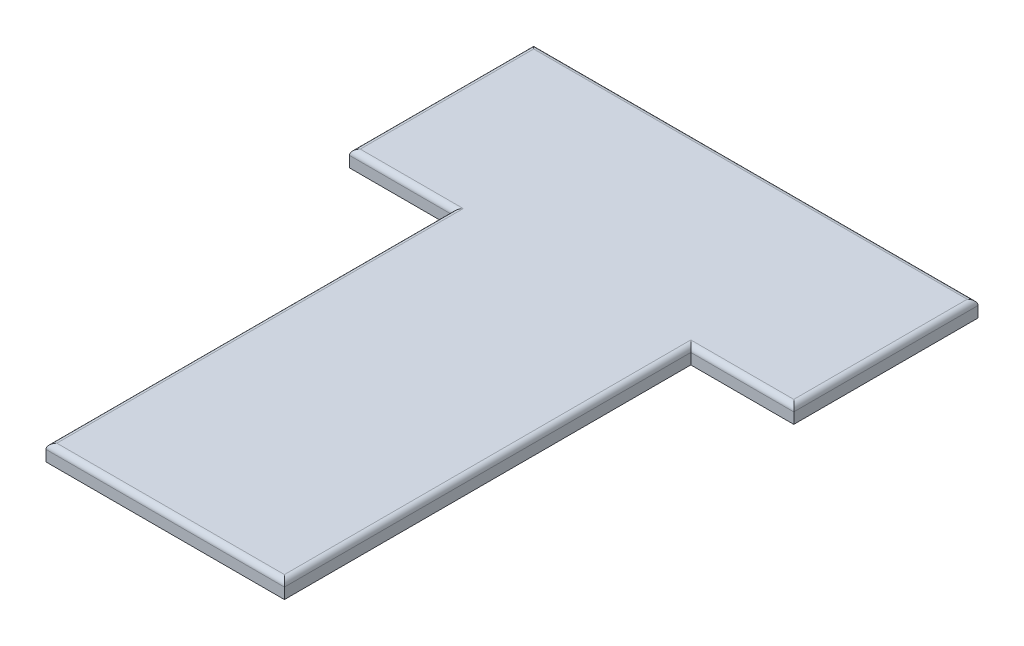
ISO-10303-21;
HEADER;
FILE_DESCRIPTION(('STEP AP214'),'2;1');
FILE_NAME('part.step','',(''),(''),'','','');
FILE_SCHEMA(('AUTOMOTIVE_DESIGN { 1 0 10303 214 1 1 1 1 }'));
ENDSEC;
DATA;
#1=APPLICATION_CONTEXT('core data for automotive mechanical design processes');
#2=APPLICATION_PROTOCOL_DEFINITION('international standard','automotive_design',2000,#1);
#3=PRODUCT_CONTEXT('',#1,'mechanical');
#4=PRODUCT('Part','Part','',(#3));
#5=PRODUCT_RELATED_PRODUCT_CATEGORY('part','',(#4));
#6=PRODUCT_DEFINITION_FORMATION('','',#4);
#7=PRODUCT_DEFINITION_CONTEXT('part definition',#1,'design');
#8=PRODUCT_DEFINITION('design','',#6,#7);
#9=PRODUCT_DEFINITION_SHAPE('','',#8);
#10=(LENGTH_UNIT() NAMED_UNIT(*) SI_UNIT(.MILLI.,.METRE.));
#11=(NAMED_UNIT(*) PLANE_ANGLE_UNIT() SI_UNIT($,.RADIAN.));
#12=(NAMED_UNIT(*) SI_UNIT($,.STERADIAN.) SOLID_ANGLE_UNIT());
#13=UNCERTAINTY_MEASURE_WITH_UNIT(LENGTH_MEASURE(1.E-05),#10,'distance_accuracy_value','');
#14=(GEOMETRIC_REPRESENTATION_CONTEXT(3) GLOBAL_UNCERTAINTY_ASSIGNED_CONTEXT((#13)) GLOBAL_UNIT_ASSIGNED_CONTEXT((#10,
#11,#12)) REPRESENTATION_CONTEXT('',''));
#15=CARTESIAN_POINT('',(0.,0.,0.));
#16=DIRECTION('',(0.,0.,1.));
#17=DIRECTION('',(1.,0.,0.));
#18=AXIS2_PLACEMENT_3D('',#15,#16,#17);
#19=CARTESIAN_POINT('',(63.,3.,0.));
#20=DIRECTION('',(0.,0.,-1.));
#21=DIRECTION('',(-1.,0.,0.));
#22=AXIS2_PLACEMENT_3D('',#19,#20,#21);
#23=PLANE('',#22);
#24=DIRECTION('',(0.,-1.,0.));
#25=VECTOR('',#24,1.);
#26=CARTESIAN_POINT('',(63.,3.,0.));
#27=LINE('',#26,#25);
#28=CARTESIAN_POINT('',(63.,2.,0.));
#29=VERTEX_POINT('',#28);
#30=CARTESIAN_POINT('',(63.,0.,0.));
#31=VERTEX_POINT('',#30);
#32=EDGE_CURVE('E126',#29,#31,#27,.T.);
#33=ORIENTED_EDGE('',*,*,#32,.F.);
#34=DIRECTION('',(1.,0.,0.));
#35=VECTOR('',#34,1.);
#36=CARTESIAN_POINT('',(63.,2.,0.));
#37=LINE('',#36,#35);
#38=CARTESIAN_POINT('',(19.,2.,0.));
#39=VERTEX_POINT('',#38);
#40=EDGE_CURVE('E206',#29,#39,#37,.F.);
#41=ORIENTED_EDGE('',*,*,#40,.T.);
#42=DIRECTION('',(0.,-1.,0.));
#43=VECTOR('',#42,1.);
#44=CARTESIAN_POINT('',(19.,3.,0.));
#45=LINE('',#44,#43);
#46=CARTESIAN_POINT('',(19.,0.,0.));
#47=VERTEX_POINT('',#46);
#48=EDGE_CURVE('E149',#39,#47,#45,.T.);
#49=ORIENTED_EDGE('',*,*,#48,.T.);
#50=DIRECTION('',(1.,0.,0.));
#51=VECTOR('',#50,1.);
#52=CARTESIAN_POINT('',(63.,0.,0.));
#53=LINE('',#52,#51);
#54=EDGE_CURVE('E144',#47,#31,#53,.T.);
#55=ORIENTED_EDGE('',*,*,#54,.T.);
#56=EDGE_LOOP('',(#33,#41,#49,#55));
#57=FACE_BOUND('',#56,.T.);
#58=ADVANCED_FACE('F36',(#57),#23,.F.);
#59=CARTESIAN_POINT('',(63.,3.,-75.));
#60=DIRECTION('',(-1.,0.,0.));
#61=DIRECTION('',(0.,0.,1.));
#62=AXIS2_PLACEMENT_3D('',#59,#60,#61);
#63=PLANE('',#62);
#64=DIRECTION('',(0.,-1.,0.));
#65=VECTOR('',#64,1.);
#66=CARTESIAN_POINT('',(63.,3.,-75.));
#67=LINE('',#66,#65);
#68=CARTESIAN_POINT('',(63.,2.,-75.));
#69=VERTEX_POINT('',#68);
#70=CARTESIAN_POINT('',(63.,0.,-75.));
#71=VERTEX_POINT('',#70);
#72=EDGE_CURVE('E138',#69,#71,#67,.T.);
#73=ORIENTED_EDGE('',*,*,#72,.F.);
#74=DIRECTION('',(0.,0.,-1.));
#75=VECTOR('',#74,1.);
#76=CARTESIAN_POINT('',(63.,2.,-75.));
#77=LINE('',#76,#75);
#78=EDGE_CURVE('E133',#69,#29,#77,.F.);
#79=ORIENTED_EDGE('',*,*,#78,.T.);
#80=ORIENTED_EDGE('',*,*,#32,.T.);
#81=DIRECTION('',(0.,0.,-1.));
#82=VECTOR('',#81,1.);
#83=CARTESIAN_POINT('',(63.,0.,-75.));
#84=LINE('',#83,#82);
#85=EDGE_CURVE('E130',#31,#71,#84,.T.);
#86=ORIENTED_EDGE('',*,*,#85,.T.);
#87=EDGE_LOOP('',(#73,#79,#80,#86));
#88=FACE_BOUND('',#87,.T.);
#89=ADVANCED_FACE('F129',(#88),#63,.F.);
#90=CARTESIAN_POINT('',(82.,3.,-75.));
#91=DIRECTION('',(0.,0.,-1.));
#92=DIRECTION('',(-1.,0.,0.));
#93=AXIS2_PLACEMENT_3D('',#90,#91,#92);
#94=PLANE('',#93);
#95=DIRECTION('',(0.,-1.,0.));
#96=VECTOR('',#95,1.);
#97=CARTESIAN_POINT('',(82.,3.,-75.));
#98=LINE('',#97,#96);
#99=CARTESIAN_POINT('',(82.,2.,-75.));
#100=VERTEX_POINT('',#99);
#101=CARTESIAN_POINT('',(82.,0.,-75.));
#102=VERTEX_POINT('',#101);
#103=EDGE_CURVE('E179',#100,#102,#98,.T.);
#104=ORIENTED_EDGE('',*,*,#103,.F.);
#105=DIRECTION('',(1.,0.,0.));
#106=VECTOR('',#105,1.);
#107=CARTESIAN_POINT('',(82.,2.,-75.));
#108=LINE('',#107,#106);
#109=EDGE_CURVE('E203',#100,#69,#108,.F.);
#110=ORIENTED_EDGE('',*,*,#109,.T.);
#111=ORIENTED_EDGE('',*,*,#72,.T.);
#112=DIRECTION('',(1.,0.,0.));
#113=VECTOR('',#112,1.);
#114=CARTESIAN_POINT('',(82.,0.,-75.));
#115=LINE('',#114,#113);
#116=EDGE_CURVE('E147',#71,#102,#115,.T.);
#117=ORIENTED_EDGE('',*,*,#116,.T.);
#118=EDGE_LOOP('',(#104,#110,#111,#117));
#119=FACE_BOUND('',#118,.T.);
#120=ADVANCED_FACE('F270',(#119),#94,.F.);
#121=CARTESIAN_POINT('',(82.,3.,-109.));
#122=DIRECTION('',(-1.,0.,0.));
#123=DIRECTION('',(0.,0.,1.));
#124=AXIS2_PLACEMENT_3D('',#121,#122,#123);
#125=PLANE('',#124);
#126=DIRECTION('',(0.,-1.,0.));
#127=VECTOR('',#126,1.);
#128=CARTESIAN_POINT('',(82.,3.,-109.));
#129=LINE('',#128,#127);
#130=CARTESIAN_POINT('',(82.,2.,-109.));
#131=VERTEX_POINT('',#130);
#132=CARTESIAN_POINT('',(82.,0.,-109.));
#133=VERTEX_POINT('',#132);
#134=EDGE_CURVE('E177',#131,#133,#129,.T.);
#135=ORIENTED_EDGE('',*,*,#134,.F.);
#136=DIRECTION('',(0.,0.,-1.));
#137=VECTOR('',#136,1.);
#138=CARTESIAN_POINT('',(82.,2.,-109.));
#139=LINE('',#138,#137);
#140=EDGE_CURVE('E201',#131,#100,#139,.F.);
#141=ORIENTED_EDGE('',*,*,#140,.T.);
#142=ORIENTED_EDGE('',*,*,#103,.T.);
#143=DIRECTION('',(0.,0.,-1.));
#144=VECTOR('',#143,1.);
#145=CARTESIAN_POINT('',(82.,0.,-109.));
#146=LINE('',#145,#144);
#147=EDGE_CURVE('E156',#102,#133,#146,.T.);
#148=ORIENTED_EDGE('',*,*,#147,.T.);
#149=EDGE_LOOP('',(#135,#141,#142,#148));
#150=FACE_BOUND('',#149,.T.);
#151=ADVANCED_FACE('F267',(#150),#125,.F.);
#152=CARTESIAN_POINT('',(0.,3.,-109.));
#153=DIRECTION('',(0.,0.,1.));
#154=DIRECTION('',(1.,0.,0.));
#155=AXIS2_PLACEMENT_3D('',#152,#153,#154);
#156=PLANE('',#155);
#157=DIRECTION('',(0.,-1.,0.));
#158=VECTOR('',#157,1.);
#159=CARTESIAN_POINT('',(0.,3.,-109.));
#160=LINE('',#159,#158);
#161=CARTESIAN_POINT('',(0.,2.,-109.));
#162=VERTEX_POINT('',#161);
#163=CARTESIAN_POINT('',(0.,0.,-109.));
#164=VERTEX_POINT('',#163);
#165=EDGE_CURVE('E175',#162,#164,#160,.T.);
#166=ORIENTED_EDGE('',*,*,#165,.F.);
#167=DIRECTION('',(-1.,0.,0.));
#168=VECTOR('',#167,1.);
#169=CARTESIAN_POINT('',(0.,2.,-109.));
#170=LINE('',#169,#168);
#171=EDGE_CURVE('E198',#162,#131,#170,.F.);
#172=ORIENTED_EDGE('',*,*,#171,.T.);
#173=ORIENTED_EDGE('',*,*,#134,.T.);
#174=DIRECTION('',(-1.,0.,0.));
#175=VECTOR('',#174,1.);
#176=CARTESIAN_POINT('',(0.,0.,-109.));
#177=LINE('',#176,#175);
#178=EDGE_CURVE('E159',#133,#164,#177,.T.);
#179=ORIENTED_EDGE('',*,*,#178,.T.);
#180=EDGE_LOOP('',(#166,#172,#173,#179));
#181=FACE_BOUND('',#180,.T.);
#182=ADVANCED_FACE('F252',(#181),#156,.F.);
#183=CARTESIAN_POINT('',(0.,3.,-75.));
#184=DIRECTION('',(1.,0.,0.));
#185=DIRECTION('',(0.,0.,-1.));
#186=AXIS2_PLACEMENT_3D('',#183,#184,#185);
#187=PLANE('',#186);
#188=DIRECTION('',(0.,-1.,0.));
#189=VECTOR('',#188,1.);
#190=CARTESIAN_POINT('',(0.,3.,-75.));
#191=LINE('',#190,#189);
#192=CARTESIAN_POINT('',(0.,2.,-75.));
#193=VERTEX_POINT('',#192);
#194=CARTESIAN_POINT('',(0.,0.,-75.));
#195=VERTEX_POINT('',#194);
#196=EDGE_CURVE('E173',#193,#195,#191,.T.);
#197=ORIENTED_EDGE('',*,*,#196,.F.);
#198=DIRECTION('',(0.,0.,1.));
#199=VECTOR('',#198,1.);
#200=CARTESIAN_POINT('',(0.,2.,-75.));
#201=LINE('',#200,#199);
#202=EDGE_CURVE('E11',#193,#162,#201,.F.);
#203=ORIENTED_EDGE('',*,*,#202,.T.);
#204=ORIENTED_EDGE('',*,*,#165,.T.);
#205=DIRECTION('',(0.,0.,1.));
#206=VECTOR('',#205,1.);
#207=CARTESIAN_POINT('',(0.,0.,-75.));
#208=LINE('',#207,#206);
#209=EDGE_CURVE('E162',#164,#195,#208,.T.);
#210=ORIENTED_EDGE('',*,*,#209,.T.);
#211=EDGE_LOOP('',(#197,#203,#204,#210));
#212=FACE_BOUND('',#211,.T.);
#213=ADVANCED_FACE('F249',(#212),#187,.F.);
#214=CARTESIAN_POINT('',(19.,3.,-75.));
#215=DIRECTION('',(0.,0.,-1.));
#216=DIRECTION('',(-1.,0.,0.));
#217=AXIS2_PLACEMENT_3D('',#214,#215,#216);
#218=PLANE('',#217);
#219=DIRECTION('',(0.,-1.,0.));
#220=VECTOR('',#219,1.);
#221=CARTESIAN_POINT('',(19.,3.,-75.));
#222=LINE('',#221,#220);
#223=CARTESIAN_POINT('',(19.,2.,-75.));
#224=VERTEX_POINT('',#223);
#225=CARTESIAN_POINT('',(19.,0.,-75.));
#226=VERTEX_POINT('',#225);
#227=EDGE_CURVE('E171',#224,#226,#222,.T.);
#228=ORIENTED_EDGE('',*,*,#227,.F.);
#229=DIRECTION('',(1.,0.,0.));
#230=VECTOR('',#229,1.);
#231=CARTESIAN_POINT('',(19.,2.,-75.));
#232=LINE('',#231,#230);
#233=EDGE_CURVE('E45',#224,#193,#232,.F.);
#234=ORIENTED_EDGE('',*,*,#233,.T.);
#235=ORIENTED_EDGE('',*,*,#196,.T.);
#236=DIRECTION('',(1.,0.,0.));
#237=VECTOR('',#236,1.);
#238=CARTESIAN_POINT('',(19.,0.,-75.));
#239=LINE('',#238,#237);
#240=EDGE_CURVE('E165',#195,#226,#239,.T.);
#241=ORIENTED_EDGE('',*,*,#240,.T.);
#242=EDGE_LOOP('',(#228,#234,#235,#241));
#243=FACE_BOUND('',#242,.T.);
#244=ADVANCED_FACE('F365',(#243),#218,.F.);
#245=CARTESIAN_POINT('',(19.,3.,0.));
#246=DIRECTION('',(1.,0.,0.));
#247=DIRECTION('',(0.,0.,-1.));
#248=AXIS2_PLACEMENT_3D('',#245,#246,#247);
#249=PLANE('',#248);
#250=ORIENTED_EDGE('',*,*,#48,.F.);
#251=DIRECTION('',(0.,0.,1.));
#252=VECTOR('',#251,1.);
#253=CARTESIAN_POINT('',(19.,2.,0.));
#254=LINE('',#253,#252);
#255=EDGE_CURVE('E60',#39,#224,#254,.F.);
#256=ORIENTED_EDGE('',*,*,#255,.T.);
#257=ORIENTED_EDGE('',*,*,#227,.T.);
#258=DIRECTION('',(0.,0.,1.));
#259=VECTOR('',#258,1.);
#260=CARTESIAN_POINT('',(19.,0.,0.));
#261=LINE('',#260,#259);
#262=EDGE_CURVE('E168',#226,#47,#261,.T.);
#263=ORIENTED_EDGE('',*,*,#262,.T.);
#264=EDGE_LOOP('',(#250,#256,#257,#263));
#265=FACE_BOUND('',#264,.T.);
#266=ADVANCED_FACE('F357',(#265),#249,.F.);
#267=CARTESIAN_POINT('',(0.,3.,0.));
#268=DIRECTION('',(0.,-1.,0.));
#269=DIRECTION('',(0.,0.,-1.));
#270=AXIS2_PLACEMENT_3D('',#267,#268,#269);
#271=PLANE('',#270);
#272=DIRECTION('',(0.,0.,-1.));
#273=VECTOR('',#272,1.);
#274=CARTESIAN_POINT('',(81.,3.,0.));
#275=LINE('',#274,#273);
#276=CARTESIAN_POINT('',(81.,3.,-76.));
#277=VERTEX_POINT('',#276);
#278=CARTESIAN_POINT('',(81.,3.,-108.));
#279=VERTEX_POINT('',#278);
#280=EDGE_CURVE('E193',#277,#279,#275,.T.);
#281=ORIENTED_EDGE('',*,*,#280,.T.);
#282=DIRECTION('',(-1.,0.,0.));
#283=VECTOR('',#282,1.);
#284=CARTESIAN_POINT('',(0.,3.,-108.));
#285=LINE('',#284,#283);
#286=CARTESIAN_POINT('',(1.,3.,-108.));
#287=VERTEX_POINT('',#286);
#288=EDGE_CURVE('E195',#279,#287,#285,.T.);
#289=ORIENTED_EDGE('',*,*,#288,.T.);
#290=DIRECTION('',(0.,0.,1.));
#291=VECTOR('',#290,1.);
#292=CARTESIAN_POINT('',(1.,3.,0.));
#293=LINE('',#292,#291);
#294=CARTESIAN_POINT('',(1.,3.,-76.));
#295=VERTEX_POINT('',#294);
#296=EDGE_CURVE('E137',#287,#295,#293,.T.);
#297=ORIENTED_EDGE('',*,*,#296,.T.);
#298=DIRECTION('',(1.,0.,0.));
#299=VECTOR('',#298,1.);
#300=CARTESIAN_POINT('',(0.,3.,-76.));
#301=LINE('',#300,#299);
#302=CARTESIAN_POINT('',(20.,3.,-76.));
#303=VERTEX_POINT('',#302);
#304=EDGE_CURVE('E183',#295,#303,#301,.T.);
#305=ORIENTED_EDGE('',*,*,#304,.T.);
#306=DIRECTION('',(0.,0.,1.));
#307=VECTOR('',#306,1.);
#308=CARTESIAN_POINT('',(20.,3.,0.));
#309=LINE('',#308,#307);
#310=CARTESIAN_POINT('',(20.,3.,-0.999999999999995));
#311=VERTEX_POINT('',#310);
#312=EDGE_CURVE('E185',#303,#311,#309,.T.);
#313=ORIENTED_EDGE('',*,*,#312,.T.);
#314=DIRECTION('',(1.,0.,0.));
#315=VECTOR('',#314,1.);
#316=CARTESIAN_POINT('',(0.,3.,-0.999999999999992));
#317=LINE('',#316,#315);
#318=CARTESIAN_POINT('',(62.,3.,-1.));
#319=VERTEX_POINT('',#318);
#320=EDGE_CURVE('E187',#311,#319,#317,.T.);
#321=ORIENTED_EDGE('',*,*,#320,.T.);
#322=DIRECTION('',(0.,0.,-1.));
#323=VECTOR('',#322,1.);
#324=CARTESIAN_POINT('',(62.,3.,0.));
#325=LINE('',#324,#323);
#326=CARTESIAN_POINT('',(62.,3.,-76.));
#327=VERTEX_POINT('',#326);
#328=EDGE_CURVE('E189',#319,#327,#325,.T.);
#329=ORIENTED_EDGE('',*,*,#328,.T.);
#330=DIRECTION('',(1.,0.,0.));
#331=VECTOR('',#330,1.);
#332=CARTESIAN_POINT('',(0.,3.,-76.));
#333=LINE('',#332,#331);
#334=EDGE_CURVE('E191',#327,#277,#333,.T.);
#335=ORIENTED_EDGE('',*,*,#334,.T.);
#336=EDGE_LOOP('',(#281,#289,#297,#305,#313,#321,#329,#335));
#337=FACE_BOUND('',#336,.T.);
#338=ADVANCED_FACE('F236',(#337),#271,.F.);
#339=CARTESIAN_POINT('',(0.,0.,0.));
#340=DIRECTION('',(0.,-1.,0.));
#341=DIRECTION('',(0.,0.,-1.));
#342=AXIS2_PLACEMENT_3D('',#339,#340,#341);
#343=PLANE('',#342);
#344=ORIENTED_EDGE('',*,*,#54,.F.);
#345=ORIENTED_EDGE('',*,*,#262,.F.);
#346=ORIENTED_EDGE('',*,*,#240,.F.);
#347=ORIENTED_EDGE('',*,*,#209,.F.);
#348=ORIENTED_EDGE('',*,*,#178,.F.);
#349=ORIENTED_EDGE('',*,*,#147,.F.);
#350=ORIENTED_EDGE('',*,*,#116,.F.);
#351=ORIENTED_EDGE('',*,*,#85,.F.);
#352=EDGE_LOOP('',(#344,#345,#346,#347,#348,#349,#350,#351));
#353=FACE_BOUND('',#352,.T.);
#354=ADVANCED_FACE('F142',(#353),#343,.T.);
#355=CARTESIAN_POINT('',(0.,2.,-0.999999999999992));
#356=DIRECTION('',(1.,0.,0.));
#357=DIRECTION('',(0.,0.,-1.));
#358=AXIS2_PLACEMENT_3D('',#355,#356,#357);
#359=CYLINDRICAL_SURFACE('',#358,1.);
#360=CARTESIAN_POINT('',(20.,2.,-0.999999999999995));
#361=DIRECTION('',(0.707106781186548,0.,0.707106781186547));
#362=DIRECTION('',(-0.707106781186547,0.,0.707106781186548));
#363=AXIS2_PLACEMENT_3D('',#360,#361,#362);
#364=ELLIPSE('',#363,1.4142135623731,1.);
#365=EDGE_CURVE('E153',#39,#311,#364,.F.);
#366=ORIENTED_EDGE('',*,*,#365,.F.);
#367=ORIENTED_EDGE('',*,*,#40,.F.);
#368=CARTESIAN_POINT('',(62.,2.,-1.));
#369=DIRECTION('',(0.707106781186547,0.,-0.707106781186548));
#370=DIRECTION('',(0.707106781186548,0.,0.707106781186547));
#371=AXIS2_PLACEMENT_3D('',#368,#369,#370);
#372=ELLIPSE('',#371,1.4142135623731,1.);
#373=EDGE_CURVE('E40',#319,#29,#372,.T.);
#374=ORIENTED_EDGE('',*,*,#373,.F.);
#375=ORIENTED_EDGE('',*,*,#320,.F.);
#376=EDGE_LOOP('',(#366,#367,#374,#375));
#377=FACE_BOUND('',#376,.T.);
#378=ADVANCED_FACE('F38',(#377),#359,.T.);
#379=CARTESIAN_POINT('',(62.,2.,0.));
#380=DIRECTION('',(0.,0.,-1.));
#381=DIRECTION('',(-1.,0.,0.));
#382=AXIS2_PLACEMENT_3D('',#379,#380,#381);
#383=CYLINDRICAL_SURFACE('',#382,1.);
#384=ORIENTED_EDGE('',*,*,#373,.T.);
#385=ORIENTED_EDGE('',*,*,#78,.F.);
#386=CARTESIAN_POINT('',(62.,2.,-76.));
#387=DIRECTION('',(0.707106781186547,0.,-0.707106781186548));
#388=DIRECTION('',(0.707106781186548,0.,0.707106781186547));
#389=AXIS2_PLACEMENT_3D('',#386,#387,#388);
#390=ELLIPSE('',#389,1.4142135623731,1.);
#391=EDGE_CURVE('E223',#327,#69,#390,.T.);
#392=ORIENTED_EDGE('',*,*,#391,.F.);
#393=ORIENTED_EDGE('',*,*,#328,.F.);
#394=EDGE_LOOP('',(#384,#385,#392,#393));
#395=FACE_BOUND('',#394,.T.);
#396=ADVANCED_FACE('F275',(#395),#383,.T.);
#397=CARTESIAN_POINT('',(20.,2.,0.));
#398=DIRECTION('',(0.,0.,1.));
#399=DIRECTION('',(1.,0.,0.));
#400=AXIS2_PLACEMENT_3D('',#397,#398,#399);
#401=CYLINDRICAL_SURFACE('',#400,1.);
#402=ORIENTED_EDGE('',*,*,#365,.T.);
#403=ORIENTED_EDGE('',*,*,#312,.F.);
#404=CARTESIAN_POINT('',(20.,2.,-76.));
#405=DIRECTION('',(0.707106781186547,0.,0.707106781186548));
#406=DIRECTION('',(-0.707106781186548,0.,0.707106781186547));
#407=AXIS2_PLACEMENT_3D('',#404,#405,#406);
#408=ELLIPSE('',#407,1.41421356237309,1.);
#409=EDGE_CURVE('E220',#224,#303,#408,.F.);
#410=ORIENTED_EDGE('',*,*,#409,.F.);
#411=ORIENTED_EDGE('',*,*,#255,.F.);
#412=EDGE_LOOP('',(#402,#403,#410,#411));
#413=FACE_BOUND('',#412,.T.);
#414=ADVANCED_FACE('F229',(#413),#401,.T.);
#415=CARTESIAN_POINT('',(0.,2.,-76.));
#416=DIRECTION('',(1.,0.,0.));
#417=DIRECTION('',(0.,0.,-1.));
#418=AXIS2_PLACEMENT_3D('',#415,#416,#417);
#419=CYLINDRICAL_SURFACE('',#418,1.);
#420=ORIENTED_EDGE('',*,*,#391,.T.);
#421=ORIENTED_EDGE('',*,*,#109,.F.);
#422=CARTESIAN_POINT('',(81.,2.,-76.));
#423=DIRECTION('',(0.707106781186547,0.,-0.707106781186547));
#424=DIRECTION('',(0.707106781186547,0.,0.707106781186547));
#425=AXIS2_PLACEMENT_3D('',#422,#423,#424);
#426=ELLIPSE('',#425,1.41421356237309,1.);
#427=EDGE_CURVE('E217',#277,#100,#426,.T.);
#428=ORIENTED_EDGE('',*,*,#427,.F.);
#429=ORIENTED_EDGE('',*,*,#334,.F.);
#430=EDGE_LOOP('',(#420,#421,#428,#429));
#431=FACE_BOUND('',#430,.T.);
#432=ADVANCED_FACE('F272',(#431),#419,.T.);
#433=CARTESIAN_POINT('',(0.,2.,-76.));
#434=DIRECTION('',(1.,0.,0.));
#435=DIRECTION('',(0.,0.,-1.));
#436=AXIS2_PLACEMENT_3D('',#433,#434,#435);
#437=CYLINDRICAL_SURFACE('',#436,1.);
#438=ORIENTED_EDGE('',*,*,#409,.T.);
#439=ORIENTED_EDGE('',*,*,#304,.F.);
#440=CARTESIAN_POINT('',(1.,2.,-76.));
#441=DIRECTION('',(0.707106781186547,0.,0.707106781186548));
#442=DIRECTION('',(-0.707106781186548,0.,0.707106781186547));
#443=AXIS2_PLACEMENT_3D('',#440,#441,#442);
#444=ELLIPSE('',#443,1.41421356237309,1.);
#445=EDGE_CURVE('E214',#193,#295,#444,.F.);
#446=ORIENTED_EDGE('',*,*,#445,.F.);
#447=ORIENTED_EDGE('',*,*,#233,.F.);
#448=EDGE_LOOP('',(#438,#439,#446,#447));
#449=FACE_BOUND('',#448,.T.);
#450=ADVANCED_FACE('F242',(#449),#437,.T.);
#451=CARTESIAN_POINT('',(81.,2.,0.));
#452=DIRECTION('',(0.,0.,-1.));
#453=DIRECTION('',(-1.,0.,0.));
#454=AXIS2_PLACEMENT_3D('',#451,#452,#453);
#455=CYLINDRICAL_SURFACE('',#454,1.);
#456=ORIENTED_EDGE('',*,*,#427,.T.);
#457=ORIENTED_EDGE('',*,*,#140,.F.);
#458=CARTESIAN_POINT('',(81.,2.,-108.));
#459=DIRECTION('',(-0.707106781186548,0.,-0.707106781186547));
#460=DIRECTION('',(0.707106781186547,0.,-0.707106781186548));
#461=AXIS2_PLACEMENT_3D('',#458,#459,#460);
#462=ELLIPSE('',#461,1.4142135623731,1.);
#463=EDGE_CURVE('E212',#279,#131,#462,.T.);
#464=ORIENTED_EDGE('',*,*,#463,.F.);
#465=ORIENTED_EDGE('',*,*,#280,.F.);
#466=EDGE_LOOP('',(#456,#457,#464,#465));
#467=FACE_BOUND('',#466,.T.);
#468=ADVANCED_FACE('F263',(#467),#455,.T.);
#469=CARTESIAN_POINT('',(1.,2.,0.));
#470=DIRECTION('',(0.,0.,1.));
#471=DIRECTION('',(1.,0.,0.));
#472=AXIS2_PLACEMENT_3D('',#469,#470,#471);
#473=CYLINDRICAL_SURFACE('',#472,1.);
#474=ORIENTED_EDGE('',*,*,#445,.T.);
#475=ORIENTED_EDGE('',*,*,#296,.F.);
#476=CARTESIAN_POINT('',(1.,2.,-108.));
#477=DIRECTION('',(-0.707106781186547,0.,0.707106781186548));
#478=DIRECTION('',(0.707106781186548,0.,0.707106781186547));
#479=AXIS2_PLACEMENT_3D('',#476,#477,#478);
#480=ELLIPSE('',#479,1.41421356237309,1.);
#481=EDGE_CURVE('E210',#162,#287,#480,.F.);
#482=ORIENTED_EDGE('',*,*,#481,.F.);
#483=ORIENTED_EDGE('',*,*,#202,.F.);
#484=EDGE_LOOP('',(#474,#475,#482,#483));
#485=FACE_BOUND('',#484,.T.);
#486=ADVANCED_FACE('F245',(#485),#473,.T.);
#487=CARTESIAN_POINT('',(0.,2.,-108.));
#488=DIRECTION('',(-1.,0.,0.));
#489=DIRECTION('',(0.,0.,1.));
#490=AXIS2_PLACEMENT_3D('',#487,#488,#489);
#491=CYLINDRICAL_SURFACE('',#490,1.);
#492=ORIENTED_EDGE('',*,*,#463,.T.);
#493=ORIENTED_EDGE('',*,*,#171,.F.);
#494=ORIENTED_EDGE('',*,*,#481,.T.);
#495=ORIENTED_EDGE('',*,*,#288,.F.);
#496=EDGE_LOOP('',(#492,#493,#494,#495));
#497=FACE_BOUND('',#496,.T.);
#498=ADVANCED_FACE('F257',(#497),#491,.T.);
#499=CLOSED_SHELL('',(#58,#89,#120,#151,#182,#213,#244,#266,#338,#354,#378,#396,#414,#432,#450,
#468,#486,#498));
#500=MANIFOLD_SOLID_BREP('B2',#499);
#501=ADVANCED_BREP_SHAPE_REPRESENTATION('',(#18,#500),#14);
#502=SHAPE_DEFINITION_REPRESENTATION(#9,#501);
ENDSEC;
END-ISO-10303-21;
